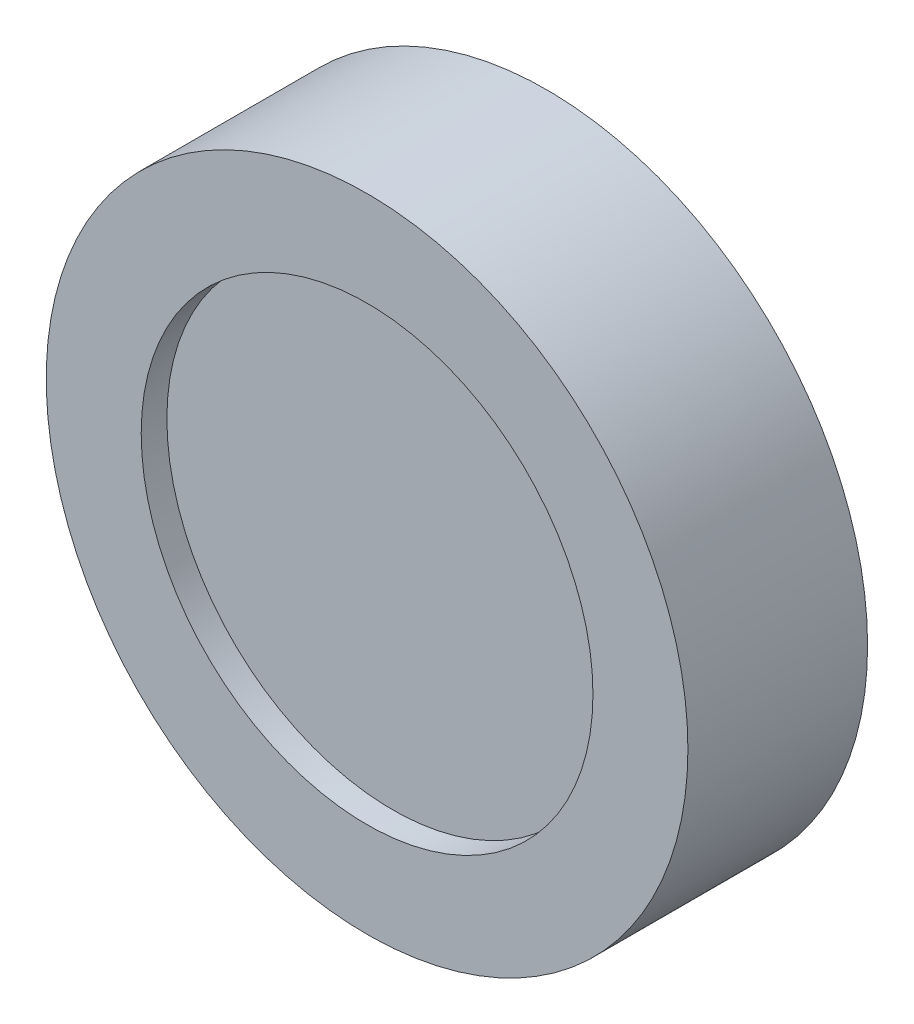
ISO-10303-21;
HEADER;
FILE_DESCRIPTION(('STEP AP214'),'2;1');
FILE_NAME('part.step','',(''),(''),'','','');
FILE_SCHEMA(('AUTOMOTIVE_DESIGN { 1 0 10303 214 1 1 1 1 }'));
ENDSEC;
DATA;
#1=APPLICATION_CONTEXT('core data for automotive mechanical design processes');
#2=APPLICATION_PROTOCOL_DEFINITION('international standard','automotive_design',2000,#1);
#3=PRODUCT_CONTEXT('',#1,'mechanical');
#4=PRODUCT('Part','Part','',(#3));
#5=PRODUCT_RELATED_PRODUCT_CATEGORY('part','',(#4));
#6=PRODUCT_DEFINITION_FORMATION('','',#4);
#7=PRODUCT_DEFINITION_CONTEXT('part definition',#1,'design');
#8=PRODUCT_DEFINITION('design','',#6,#7);
#9=PRODUCT_DEFINITION_SHAPE('','',#8);
#10=(LENGTH_UNIT() NAMED_UNIT(*) SI_UNIT(.MILLI.,.METRE.));
#11=(NAMED_UNIT(*) PLANE_ANGLE_UNIT() SI_UNIT($,.RADIAN.));
#12=(NAMED_UNIT(*) SI_UNIT($,.STERADIAN.) SOLID_ANGLE_UNIT());
#13=UNCERTAINTY_MEASURE_WITH_UNIT(LENGTH_MEASURE(1.E-05),#10,'distance_accuracy_value','');
#14=(GEOMETRIC_REPRESENTATION_CONTEXT(3) GLOBAL_UNCERTAINTY_ASSIGNED_CONTEXT((#13)) GLOBAL_UNIT_ASSIGNED_CONTEXT((#10,
#11,#12)) REPRESENTATION_CONTEXT('',''));
#15=CARTESIAN_POINT('',(0.,0.,0.));
#16=DIRECTION('',(0.,0.,1.));
#17=DIRECTION('',(1.,0.,0.));
#18=AXIS2_PLACEMENT_3D('',#15,#16,#17);
#19=CARTESIAN_POINT('',(0.,0.,3.5));
#20=DIRECTION('',(0.,0.,-1.));
#21=DIRECTION('',(-1.,0.,0.));
#22=AXIS2_PLACEMENT_3D('',#19,#20,#21);
#23=CYLINDRICAL_SURFACE('',#22,6.25);
#24=CARTESIAN_POINT('',(0.,0.,3.5));
#25=DIRECTION('',(0.,0.,1.));
#26=DIRECTION('',(1.,0.,0.));
#27=AXIS2_PLACEMENT_3D('',#24,#25,#26);
#28=CIRCLE('',#27,6.25);
#29=CARTESIAN_POINT('',(6.25,0.,3.5));
#30=VERTEX_POINT('',#29);
#31=EDGE_CURVE('E12',#30,#30,#28,.T.);
#32=ORIENTED_EDGE('',*,*,#31,.F.);
#33=EDGE_LOOP('',(#32));
#34=FACE_BOUND('',#33,.T.);
#35=CARTESIAN_POINT('',(0.,0.,0.));
#36=DIRECTION('',(0.,0.,1.));
#37=DIRECTION('',(1.,0.,0.));
#38=AXIS2_PLACEMENT_3D('',#35,#36,#37);
#39=CIRCLE('',#38,6.25);
#40=CARTESIAN_POINT('',(6.25,0.,0.));
#41=VERTEX_POINT('',#40);
#42=EDGE_CURVE('E47',#41,#41,#39,.T.);
#43=ORIENTED_EDGE('',*,*,#42,.T.);
#44=EDGE_LOOP('',(#43));
#45=FACE_BOUND('',#44,.T.);
#46=ADVANCED_FACE('F44',(#34,#45),#23,.T.);
#47=CARTESIAN_POINT('',(0.,0.,3.5));
#48=DIRECTION('',(0.,0.,1.));
#49=DIRECTION('',(1.,0.,0.));
#50=AXIS2_PLACEMENT_3D('',#47,#48,#49);
#51=PLANE('',#50);
#52=CARTESIAN_POINT('',(0.,0.,3.5));
#53=DIRECTION('',(0.,0.,1.));
#54=DIRECTION('',(1.,0.,0.));
#55=AXIS2_PLACEMENT_3D('',#52,#53,#54);
#56=CIRCLE('',#55,4.4);
#57=CARTESIAN_POINT('',(4.4,0.,3.5));
#58=VERTEX_POINT('',#57);
#59=EDGE_CURVE('E56',#58,#58,#56,.T.);
#60=ORIENTED_EDGE('',*,*,#59,.F.);
#61=EDGE_LOOP('',(#60));
#62=FACE_BOUND('',#61,.T.);
#63=ORIENTED_EDGE('',*,*,#31,.T.);
#64=EDGE_LOOP('',(#63));
#65=FACE_BOUND('',#64,.T.);
#66=ADVANCED_FACE('F80',(#62,#65),#51,.T.);
#67=CARTESIAN_POINT('',(0.,0.,0.));
#68=DIRECTION('',(0.,0.,1.));
#69=DIRECTION('',(1.,0.,0.));
#70=AXIS2_PLACEMENT_3D('',#67,#68,#69);
#71=PLANE('',#70);
#72=CARTESIAN_POINT('',(0.,0.,0.));
#73=DIRECTION('',(0.,0.,1.));
#74=DIRECTION('',(1.,0.,0.));
#75=AXIS2_PLACEMENT_3D('',#72,#73,#74);
#76=CIRCLE('',#75,4.4);
#77=CARTESIAN_POINT('',(4.4,0.,0.));
#78=VERTEX_POINT('',#77);
#79=EDGE_CURVE('E62',#78,#78,#76,.T.);
#80=ORIENTED_EDGE('',*,*,#79,.T.);
#81=EDGE_LOOP('',(#80));
#82=FACE_BOUND('',#81,.T.);
#83=ORIENTED_EDGE('',*,*,#42,.F.);
#84=EDGE_LOOP('',(#83));
#85=FACE_BOUND('',#84,.T.);
#86=ADVANCED_FACE('F85',(#82,#85),#71,.F.);
#87=CARTESIAN_POINT('',(0.,0.,3.));
#88=DIRECTION('',(0.,0.,1.));
#89=DIRECTION('',(1.,0.,0.));
#90=AXIS2_PLACEMENT_3D('',#87,#88,#89);
#91=CYLINDRICAL_SURFACE('',#90,4.4);
#92=CARTESIAN_POINT('',(0.,0.,3.));
#93=DIRECTION('',(0.,0.,1.));
#94=DIRECTION('',(1.,0.,0.));
#95=AXIS2_PLACEMENT_3D('',#92,#93,#94);
#96=CIRCLE('',#95,4.4);
#97=CARTESIAN_POINT('',(4.4,0.,3.));
#98=VERTEX_POINT('',#97);
#99=EDGE_CURVE('E54',#98,#98,#96,.T.);
#100=ORIENTED_EDGE('',*,*,#99,.F.);
#101=EDGE_LOOP('',(#100));
#102=FACE_BOUND('',#101,.T.);
#103=ORIENTED_EDGE('',*,*,#59,.T.);
#104=EDGE_LOOP('',(#103));
#105=FACE_BOUND('',#104,.T.);
#106=ADVANCED_FACE('F92',(#102,#105),#91,.F.);
#107=CARTESIAN_POINT('',(0.,0.,3.));
#108=DIRECTION('',(0.,0.,1.));
#109=DIRECTION('',(1.,0.,0.));
#110=AXIS2_PLACEMENT_3D('',#107,#108,#109);
#111=PLANE('',#110);
#112=ORIENTED_EDGE('',*,*,#99,.T.);
#113=EDGE_LOOP('',(#112));
#114=FACE_BOUND('',#113,.T.);
#115=ADVANCED_FACE('F77',(#114),#111,.T.);
#116=CARTESIAN_POINT('',(0.,0.,0.5));
#117=DIRECTION('',(0.,0.,-1.));
#118=DIRECTION('',(-1.,0.,0.));
#119=AXIS2_PLACEMENT_3D('',#116,#117,#118);
#120=CYLINDRICAL_SURFACE('',#119,4.4);
#121=CARTESIAN_POINT('',(0.,0.,0.5));
#122=DIRECTION('',(0.,0.,1.));
#123=DIRECTION('',(1.,0.,0.));
#124=AXIS2_PLACEMENT_3D('',#121,#122,#123);
#125=CIRCLE('',#124,4.4);
#126=CARTESIAN_POINT('',(4.4,0.,0.5));
#127=VERTEX_POINT('',#126);
#128=EDGE_CURVE('E59',#127,#127,#125,.T.);
#129=ORIENTED_EDGE('',*,*,#128,.T.);
#130=EDGE_LOOP('',(#129));
#131=FACE_BOUND('',#130,.T.);
#132=ORIENTED_EDGE('',*,*,#79,.F.);
#133=EDGE_LOOP('',(#132));
#134=FACE_BOUND('',#133,.T.);
#135=ADVANCED_FACE('F68',(#131,#134),#120,.F.);
#136=CARTESIAN_POINT('',(0.,0.,0.5));
#137=DIRECTION('',(0.,0.,-1.));
#138=DIRECTION('',(1.,0.,0.));
#139=AXIS2_PLACEMENT_3D('',#136,#137,#138);
#140=PLANE('',#139);
#141=ORIENTED_EDGE('',*,*,#128,.F.);
#142=EDGE_LOOP('',(#141));
#143=FACE_BOUND('',#142,.T.);
#144=ADVANCED_FACE('F71',(#143),#140,.T.);
#145=CLOSED_SHELL('',(#46,#66,#86,#106,#115,#135,#144));
#146=MANIFOLD_SOLID_BREP('B2',#145);
#147=ADVANCED_BREP_SHAPE_REPRESENTATION('',(#18,#146),#14);
#148=SHAPE_DEFINITION_REPRESENTATION(#9,#147);
ENDSEC;
END-ISO-10303-21;
